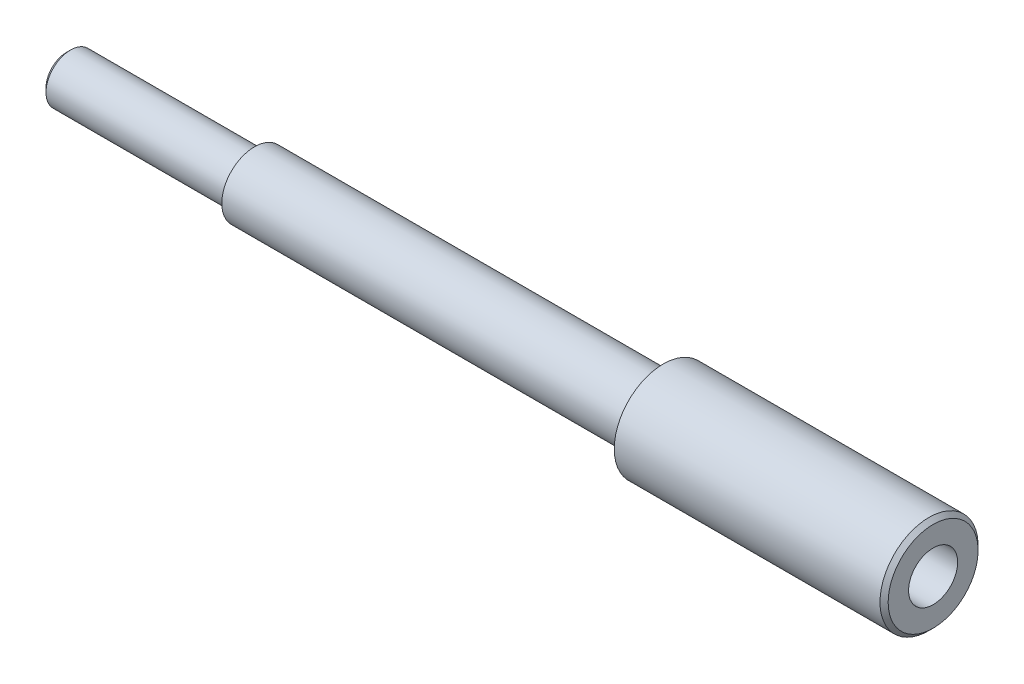
ISO-10303-21;
HEADER;
FILE_DESCRIPTION(('STEP AP214'),'2;1');
FILE_NAME('part.step','',(''),(''),'','','');
FILE_SCHEMA(('AUTOMOTIVE_DESIGN { 1 0 10303 214 1 1 1 1 }'));
ENDSEC;
DATA;
#1=APPLICATION_CONTEXT('core data for automotive mechanical design processes');
#2=APPLICATION_PROTOCOL_DEFINITION('international standard','automotive_design',2000,#1);
#3=PRODUCT_CONTEXT('',#1,'mechanical');
#4=PRODUCT('Part','Part','',(#3));
#5=PRODUCT_RELATED_PRODUCT_CATEGORY('part','',(#4));
#6=PRODUCT_DEFINITION_FORMATION('','',#4);
#7=PRODUCT_DEFINITION_CONTEXT('part definition',#1,'design');
#8=PRODUCT_DEFINITION('design','',#6,#7);
#9=PRODUCT_DEFINITION_SHAPE('','',#8);
#10=(LENGTH_UNIT() NAMED_UNIT(*) SI_UNIT(.MILLI.,.METRE.));
#11=(NAMED_UNIT(*) PLANE_ANGLE_UNIT() SI_UNIT($,.RADIAN.));
#12=(NAMED_UNIT(*) SI_UNIT($,.STERADIAN.) SOLID_ANGLE_UNIT());
#13=UNCERTAINTY_MEASURE_WITH_UNIT(LENGTH_MEASURE(1.E-05),#10,'distance_accuracy_value','');
#14=(GEOMETRIC_REPRESENTATION_CONTEXT(3) GLOBAL_UNCERTAINTY_ASSIGNED_CONTEXT((#13)) GLOBAL_UNIT_ASSIGNED_CONTEXT((#10,
#11,#12)) REPRESENTATION_CONTEXT('',''));
#15=CARTESIAN_POINT('',(0.,0.,0.));
#16=DIRECTION('',(0.,0.,1.));
#17=DIRECTION('',(1.,0.,0.));
#18=AXIS2_PLACEMENT_3D('',#15,#16,#17);
#19=CARTESIAN_POINT('',(0.,0.,0.));
#20=DIRECTION('',(1.,0.,0.));
#21=DIRECTION('',(0.,0.,-1.));
#22=AXIS2_PLACEMENT_3D('',#19,#20,#21);
#23=PLANE('',#22);
#24=CARTESIAN_POINT('',(0.,0.,0.));
#25=DIRECTION('',(-1.,0.,0.));
#26=DIRECTION('',(0.,0.,1.));
#27=AXIS2_PLACEMENT_3D('',#24,#25,#26);
#28=CIRCLE('',#27,2.5);
#29=CARTESIAN_POINT('',(0.,0.,2.5));
#30=VERTEX_POINT('',#29);
#31=EDGE_CURVE('E10',#30,#30,#28,.T.);
#32=ORIENTED_EDGE('',*,*,#31,.T.);
#33=EDGE_LOOP('',(#32));
#34=FACE_BOUND('',#33,.T.);
#35=ADVANCED_FACE('F37',(#34),#23,.F.);
#36=CARTESIAN_POINT('',(0.5,0.,0.));
#37=DIRECTION('',(1.,0.,0.));
#38=DIRECTION('',(0.,0.,-1.));
#39=AXIS2_PLACEMENT_3D('',#36,#37,#38);
#40=CONICAL_SURFACE('',#39,3.,0.785398163397449);
#41=ORIENTED_EDGE('',*,*,#31,.F.);
#42=EDGE_LOOP('',(#41));
#43=FACE_BOUND('',#42,.T.);
#44=CARTESIAN_POINT('',(0.5,0.,0.));
#45=DIRECTION('',(-1.,0.,0.));
#46=DIRECTION('',(0.,0.,1.));
#47=AXIS2_PLACEMENT_3D('',#44,#45,#46);
#48=CIRCLE('',#47,3.);
#49=CARTESIAN_POINT('',(0.5,0.,3.));
#50=VERTEX_POINT('',#49);
#51=EDGE_CURVE('E43',#50,#50,#48,.T.);
#52=ORIENTED_EDGE('',*,*,#51,.T.);
#53=EDGE_LOOP('',(#52));
#54=FACE_BOUND('',#53,.T.);
#55=ADVANCED_FACE('F87',(#43,#54),#40,.T.);
#56=CARTESIAN_POINT('',(-5.,0.,0.));
#57=DIRECTION('',(-1.,0.,0.));
#58=DIRECTION('',(0.,0.,1.));
#59=AXIS2_PLACEMENT_3D('',#56,#57,#58);
#60=CYLINDRICAL_SURFACE('',#59,3.);
#61=ORIENTED_EDGE('',*,*,#51,.F.);
#62=EDGE_LOOP('',(#61));
#63=FACE_BOUND('',#62,.T.);
#64=CARTESIAN_POINT('',(23.,0.,0.));
#65=DIRECTION('',(-1.,0.,0.));
#66=DIRECTION('',(0.,0.,1.));
#67=AXIS2_PLACEMENT_3D('',#64,#65,#66);
#68=CIRCLE('',#67,3.);
#69=CARTESIAN_POINT('',(23.,0.,3.));
#70=VERTEX_POINT('',#69);
#71=EDGE_CURVE('E47',#70,#70,#68,.T.);
#72=ORIENTED_EDGE('',*,*,#71,.T.);
#73=EDGE_LOOP('',(#72));
#74=FACE_BOUND('',#73,.T.);
#75=ADVANCED_FACE('F91',(#63,#74),#60,.T.);
#76=CARTESIAN_POINT('',(23.,3.,0.));
#77=DIRECTION('',(1.,0.,0.));
#78=DIRECTION('',(0.,0.,-1.));
#79=AXIS2_PLACEMENT_3D('',#76,#77,#78);
#80=PLANE('',#79);
#81=ORIENTED_EDGE('',*,*,#71,.F.);
#82=EDGE_LOOP('',(#81));
#83=FACE_BOUND('',#82,.T.);
#84=CARTESIAN_POINT('',(23.,0.,0.));
#85=DIRECTION('',(-1.,0.,0.));
#86=DIRECTION('',(0.,0.,1.));
#87=AXIS2_PLACEMENT_3D('',#84,#85,#86);
#88=CIRCLE('',#87,4.);
#89=CARTESIAN_POINT('',(23.,0.,4.));
#90=VERTEX_POINT('',#89);
#91=EDGE_CURVE('E51',#90,#90,#88,.T.);
#92=ORIENTED_EDGE('',*,*,#91,.T.);
#93=EDGE_LOOP('',(#92));
#94=FACE_BOUND('',#93,.T.);
#95=ADVANCED_FACE('F96',(#83,#94),#80,.F.);
#96=CARTESIAN_POINT('',(-5.,0.,0.));
#97=DIRECTION('',(-1.,0.,0.));
#98=DIRECTION('',(0.,0.,1.));
#99=AXIS2_PLACEMENT_3D('',#96,#97,#98);
#100=CYLINDRICAL_SURFACE('',#99,4.);
#101=ORIENTED_EDGE('',*,*,#91,.F.);
#102=EDGE_LOOP('',(#101));
#103=FACE_BOUND('',#102,.T.);
#104=CARTESIAN_POINT('',(73.,0.,0.));
#105=DIRECTION('',(-1.,0.,0.));
#106=DIRECTION('',(0.,0.,1.));
#107=AXIS2_PLACEMENT_3D('',#104,#105,#106);
#108=CIRCLE('',#107,4.);
#109=CARTESIAN_POINT('',(73.,0.,4.));
#110=VERTEX_POINT('',#109);
#111=EDGE_CURVE('E56',#110,#110,#108,.T.);
#112=ORIENTED_EDGE('',*,*,#111,.T.);
#113=EDGE_LOOP('',(#112));
#114=FACE_BOUND('',#113,.T.);
#115=ADVANCED_FACE('F102',(#103,#114),#100,.T.);
#116=CARTESIAN_POINT('',(73.,4.,0.));
#117=DIRECTION('',(1.,0.,0.));
#118=DIRECTION('',(0.,0.,-1.));
#119=AXIS2_PLACEMENT_3D('',#116,#117,#118);
#120=PLANE('',#119);
#121=ORIENTED_EDGE('',*,*,#111,.F.);
#122=EDGE_LOOP('',(#121));
#123=FACE_BOUND('',#122,.T.);
#124=CARTESIAN_POINT('',(73.,0.,0.));
#125=DIRECTION('',(-1.,0.,0.));
#126=DIRECTION('',(0.,0.,1.));
#127=AXIS2_PLACEMENT_3D('',#124,#125,#126);
#128=CIRCLE('',#127,6.);
#129=CARTESIAN_POINT('',(73.,0.,6.));
#130=VERTEX_POINT('',#129);
#131=EDGE_CURVE('E59',#130,#130,#128,.T.);
#132=ORIENTED_EDGE('',*,*,#131,.T.);
#133=EDGE_LOOP('',(#132));
#134=FACE_BOUND('',#133,.T.);
#135=ADVANCED_FACE('F106',(#123,#134),#120,.F.);
#136=CARTESIAN_POINT('',(-5.,0.,0.));
#137=DIRECTION('',(-1.,0.,0.));
#138=DIRECTION('',(0.,0.,1.));
#139=AXIS2_PLACEMENT_3D('',#136,#137,#138);
#140=CYLINDRICAL_SURFACE('',#139,6.);
#141=ORIENTED_EDGE('',*,*,#131,.F.);
#142=EDGE_LOOP('',(#141));
#143=FACE_BOUND('',#142,.T.);
#144=CARTESIAN_POINT('',(105.5,0.,0.));
#145=DIRECTION('',(-1.,0.,0.));
#146=DIRECTION('',(0.,0.,1.));
#147=AXIS2_PLACEMENT_3D('',#144,#145,#146);
#148=CIRCLE('',#147,6.);
#149=CARTESIAN_POINT('',(105.5,0.,6.));
#150=VERTEX_POINT('',#149);
#151=EDGE_CURVE('E62',#150,#150,#148,.T.);
#152=ORIENTED_EDGE('',*,*,#151,.T.);
#153=EDGE_LOOP('',(#152));
#154=FACE_BOUND('',#153,.T.);
#155=ADVANCED_FACE('F110',(#143,#154),#140,.T.);
#156=CARTESIAN_POINT('',(106.,0.,0.));
#157=DIRECTION('',(-1.,0.,0.));
#158=DIRECTION('',(0.,0.,1.));
#159=AXIS2_PLACEMENT_3D('',#156,#157,#158);
#160=CONICAL_SURFACE('',#159,5.5,0.785398163397448);
#161=ORIENTED_EDGE('',*,*,#151,.F.);
#162=EDGE_LOOP('',(#161));
#163=FACE_BOUND('',#162,.T.);
#164=CARTESIAN_POINT('',(106.,0.,0.));
#165=DIRECTION('',(-1.,0.,0.));
#166=DIRECTION('',(0.,0.,1.));
#167=AXIS2_PLACEMENT_3D('',#164,#165,#166);
#168=CIRCLE('',#167,5.5);
#169=CARTESIAN_POINT('',(106.,0.,5.5));
#170=VERTEX_POINT('',#169);
#171=EDGE_CURVE('E65',#170,#170,#168,.T.);
#172=ORIENTED_EDGE('',*,*,#171,.T.);
#173=EDGE_LOOP('',(#172));
#174=FACE_BOUND('',#173,.T.);
#175=ADVANCED_FACE('F114',(#163,#174),#160,.T.);
#176=CARTESIAN_POINT('',(106.,5.5,0.));
#177=DIRECTION('',(-1.,0.,0.));
#178=DIRECTION('',(0.,0.,1.));
#179=AXIS2_PLACEMENT_3D('',#176,#177,#178);
#180=PLANE('',#179);
#181=ORIENTED_EDGE('',*,*,#171,.F.);
#182=EDGE_LOOP('',(#181));
#183=FACE_BOUND('',#182,.T.);
#184=CARTESIAN_POINT('',(106.,0.,0.));
#185=DIRECTION('',(-1.,0.,0.));
#186=DIRECTION('',(0.,0.,1.));
#187=AXIS2_PLACEMENT_3D('',#184,#185,#186);
#188=CIRCLE('',#187,3.);
#189=CARTESIAN_POINT('',(106.,0.,3.));
#190=VERTEX_POINT('',#189);
#191=EDGE_CURVE('E68',#190,#190,#188,.T.);
#192=ORIENTED_EDGE('',*,*,#191,.T.);
#193=EDGE_LOOP('',(#192));
#194=FACE_BOUND('',#193,.T.);
#195=ADVANCED_FACE('F83',(#183,#194),#180,.F.);
#196=CARTESIAN_POINT('',(-5.,0.,0.));
#197=DIRECTION('',(-1.,0.,0.));
#198=DIRECTION('',(0.,0.,1.));
#199=AXIS2_PLACEMENT_3D('',#196,#197,#198);
#200=CYLINDRICAL_SURFACE('',#199,3.);
#201=ORIENTED_EDGE('',*,*,#191,.F.);
#202=EDGE_LOOP('',(#201));
#203=FACE_BOUND('',#202,.T.);
#204=CARTESIAN_POINT('',(92.,0.,0.));
#205=DIRECTION('',(-1.,0.,0.));
#206=DIRECTION('',(0.,0.,1.));
#207=AXIS2_PLACEMENT_3D('',#204,#205,#206);
#208=CIRCLE('',#207,3.);
#209=CARTESIAN_POINT('',(92.,0.,3.));
#210=VERTEX_POINT('',#209);
#211=EDGE_CURVE('E71',#210,#210,#208,.T.);
#212=ORIENTED_EDGE('',*,*,#211,.T.);
#213=EDGE_LOOP('',(#212));
#214=FACE_BOUND('',#213,.T.);
#215=ADVANCED_FACE('F75',(#203,#214),#200,.F.);
#216=CARTESIAN_POINT('',(92.,3.,0.));
#217=DIRECTION('',(-1.,0.,0.));
#218=DIRECTION('',(0.,0.,1.));
#219=AXIS2_PLACEMENT_3D('',#216,#217,#218);
#220=PLANE('',#219);
#221=ORIENTED_EDGE('',*,*,#211,.F.);
#222=EDGE_LOOP('',(#221));
#223=FACE_BOUND('',#222,.T.);
#224=ADVANCED_FACE('F77',(#223),#220,.F.);
#225=CLOSED_SHELL('',(#35,#55,#75,#95,#115,#135,#155,#175,#195,#215,#224));
#226=MANIFOLD_SOLID_BREP('B2',#225);
#227=ADVANCED_BREP_SHAPE_REPRESENTATION('',(#18,#226),#14);
#228=SHAPE_DEFINITION_REPRESENTATION(#9,#227);
ENDSEC;
END-ISO-10303-21;
